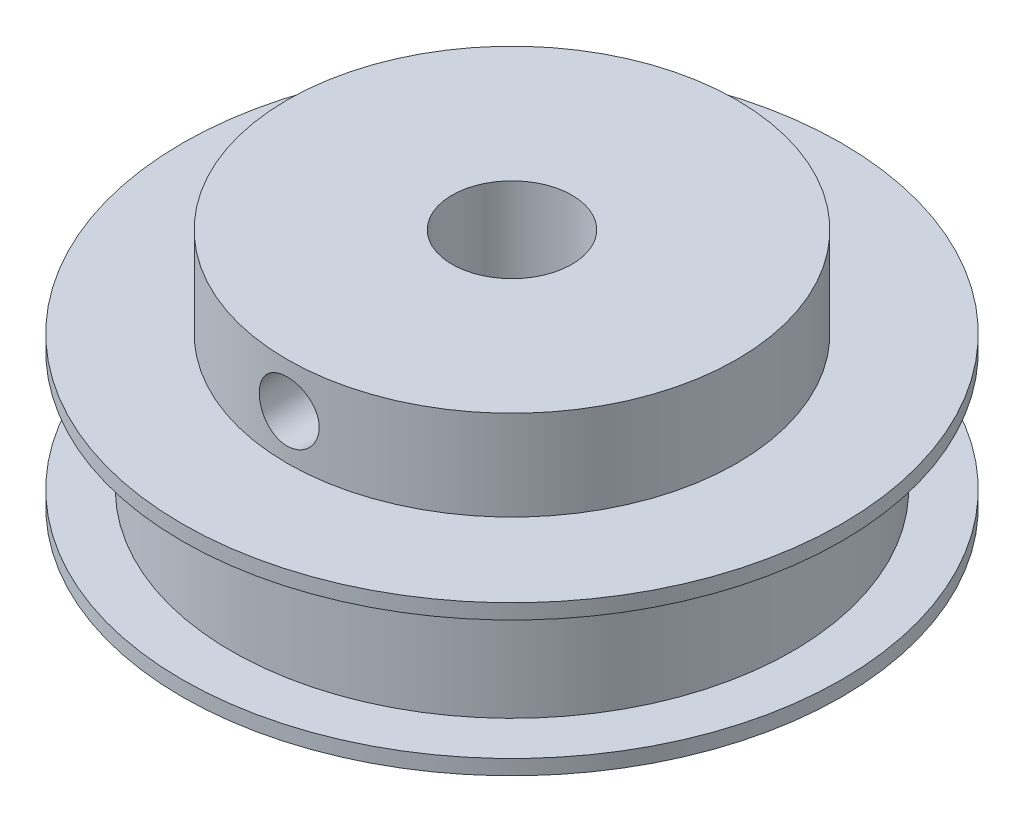
ISO-10303-21;
HEADER;
FILE_DESCRIPTION(('STEP AP214'),'2;1');
FILE_NAME('part.step','',(''),(''),'','','');
FILE_SCHEMA(('AUTOMOTIVE_DESIGN { 1 0 10303 214 1 1 1 1 }'));
ENDSEC;
DATA;
#1=APPLICATION_CONTEXT('core data for automotive mechanical design processes');
#2=APPLICATION_PROTOCOL_DEFINITION('international standard','automotive_design',2000,#1);
#3=PRODUCT_CONTEXT('',#1,'mechanical');
#4=PRODUCT('Part','Part','',(#3));
#5=PRODUCT_RELATED_PRODUCT_CATEGORY('part','',(#4));
#6=PRODUCT_DEFINITION_FORMATION('','',#4);
#7=PRODUCT_DEFINITION_CONTEXT('part definition',#1,'design');
#8=PRODUCT_DEFINITION('design','',#6,#7);
#9=PRODUCT_DEFINITION_SHAPE('','',#8);
#10=(LENGTH_UNIT() NAMED_UNIT(*) SI_UNIT(.MILLI.,.METRE.));
#11=(NAMED_UNIT(*) PLANE_ANGLE_UNIT() SI_UNIT($,.RADIAN.));
#12=(NAMED_UNIT(*) SI_UNIT($,.STERADIAN.) SOLID_ANGLE_UNIT());
#13=UNCERTAINTY_MEASURE_WITH_UNIT(LENGTH_MEASURE(1.E-05),#10,'distance_accuracy_value','');
#14=(GEOMETRIC_REPRESENTATION_CONTEXT(3) GLOBAL_UNCERTAINTY_ASSIGNED_CONTEXT((#13)) GLOBAL_UNIT_ASSIGNED_CONTEXT((#10,
#11,#12)) REPRESENTATION_CONTEXT('',''));
#15=CARTESIAN_POINT('',(0.,0.,0.));
#16=DIRECTION('',(0.,0.,1.));
#17=DIRECTION('',(1.,0.,0.));
#18=AXIS2_PLACEMENT_3D('',#15,#16,#17);
#19=CARTESIAN_POINT('',(22.0154,10.0154,22.0154));
#20=DIRECTION('',(0.,-1.,0.));
#21=DIRECTION('',(0.,0.,-1.));
#22=AXIS2_PLACEMENT_3D('',#19,#20,#21);
#23=PLANE('',#22);
#24=CARTESIAN_POINT('',(22.0154,10.0154,22.0154));
#25=DIRECTION('',(0.,-1.,0.));
#26=DIRECTION('',(0.,0.,-1.));
#27=AXIS2_PLACEMENT_3D('',#24,#25,#26);
#28=CIRCLE('',#27,15.);
#29=CARTESIAN_POINT('',(22.0154,10.0154,7.0154));
#30=VERTEX_POINT('',#29);
#31=EDGE_CURVE('E16',#30,#30,#28,.F.);
#32=ORIENTED_EDGE('',*,*,#31,.F.);
#33=EDGE_LOOP('',(#32));
#34=FACE_BOUND('',#33,.T.);
#35=CARTESIAN_POINT('',(22.0154,10.0154,22.0154));
#36=DIRECTION('',(0.,-1.,0.));
#37=DIRECTION('',(0.,0.,-1.));
#38=AXIS2_PLACEMENT_3D('',#35,#36,#37);
#39=CIRCLE('',#38,22.);
#40=CARTESIAN_POINT('',(22.0154,10.0154,0.0154000000000022));
#41=VERTEX_POINT('',#40);
#42=EDGE_CURVE('E175',#41,#41,#39,.T.);
#43=ORIENTED_EDGE('',*,*,#42,.F.);
#44=EDGE_LOOP('',(#43));
#45=FACE_BOUND('',#44,.T.);
#46=ADVANCED_FACE('F13',(#34,#45),#23,.F.);
#47=CARTESIAN_POINT('',(22.0154,16.0154,22.0154));
#48=DIRECTION('',(0.,-1.,0.));
#49=DIRECTION('',(0.,0.,-1.));
#50=AXIS2_PLACEMENT_3D('',#47,#48,#49);
#51=CYLINDRICAL_SURFACE('',#50,15.);
#52=ORIENTED_EDGE('',*,*,#31,.T.);
#53=EDGE_LOOP('',(#52));
#54=FACE_BOUND('',#53,.T.);
#55=CARTESIAN_POINT('',(22.0154,11.0154,37.0154));
#56=CARTESIAN_POINT('',(21.9036946954934,11.0154049613431,37.0153983257674));
#57=CARTESIAN_POINT('',(21.7918437427988,11.0247976429549,37.0141380496961));
#58=CARTESIAN_POINT('',(21.5711796176118,11.0621369309743,37.0092289387345));
#59=CARTESIAN_POINT('',(21.4623732214976,11.0901219508408,37.0055751588671));
#60=CARTESIAN_POINT('',(21.2511417659181,11.1638062974057,36.9962902244685));
#61=CARTESIAN_POINT('',(21.1487098272994,11.2094861295703,36.990661246671));
#62=CARTESIAN_POINT('',(20.9530121858702,11.3172222450371,36.9780521426859));
#63=CARTESIAN_POINT('',(20.8597427640481,11.3792718459401,36.9710725681426));
#64=CARTESIAN_POINT('',(20.6843766330214,11.5184115007537,36.9564901322612));
#65=CARTESIAN_POINT('',(20.6023462037743,11.5955847596861,36.9488839642909));
#66=CARTESIAN_POINT('',(20.4523559962916,11.7626056755836,36.933931744923));
#67=CARTESIAN_POINT('',(20.3843976685819,11.8524546375333,36.9265857204051));
#68=CARTESIAN_POINT('',(20.2642407285059,12.0426995426072,36.9129543242582));
#69=CARTESIAN_POINT('',(20.2121034729947,12.1431345628483,36.9066731227066));
#70=CARTESIAN_POINT('',(20.1254612435027,12.3514320106051,36.8959258346049));
#71=CARTESIAN_POINT('',(20.0909553564559,12.4592940531733,36.8914596540638));
#72=CARTESIAN_POINT('',(20.0407539551392,12.678705715276,36.8848793685706));
#73=CARTESIAN_POINT('',(20.0249479847177,12.7902296410357,36.8827514573656));
#74=CARTESIAN_POINT('',(20.0122531895047,13.0143659849075,36.8810465154151));
#75=CARTESIAN_POINT('',(20.0153635351347,13.1269783550694,36.8814693728052));
#76=CARTESIAN_POINT('',(20.0403224842393,13.3493206475116,36.8848055504524));
#77=CARTESIAN_POINT('',(20.0620488270012,13.4590645727699,36.8877026208903));
#78=CARTESIAN_POINT('',(20.1234324153905,13.6733359230729,36.8956354837488));
#79=CARTESIAN_POINT('',(20.1630902258453,13.7778631836814,36.9006713435393));
#80=CARTESIAN_POINT('',(20.2593426149041,13.9791136822843,36.9123328460932));
#81=CARTESIAN_POINT('',(20.3159904626973,14.0758111422296,36.9189634758238));
#82=CARTESIAN_POINT('',(20.4445719787059,14.2583660110646,36.933062963231));
#83=CARTESIAN_POINT('',(20.516505215272,14.3442237259525,36.9405317972346));
#84=CARTESIAN_POINT('',(20.6742767329484,14.5033649079682,36.9555372895568));
#85=CARTESIAN_POINT('',(20.7602176994564,14.5765465915741,36.9630740277318));
#86=CARTESIAN_POINT('',(20.9432634149749,14.7074959146257,36.9773161866147));
#87=CARTESIAN_POINT('',(21.0403732241592,14.7652565277029,36.9840212276305));
#88=CARTESIAN_POINT('',(21.2431069606347,14.8637198858254,36.9958501014816));
#89=CARTESIAN_POINT('',(21.3487411358715,14.904401723372,37.000971994248));
#90=CARTESIAN_POINT('',(21.5652829965604,14.9673371997727,37.0090343309841));
#91=CARTESIAN_POINT('',(21.6761789968537,14.989629821051,37.0119793881381));
#92=CARTESIAN_POINT('',(21.8257688953526,15.0067537566856,37.0142493301432));
#93=CARTESIAN_POINT('',(21.8636166300375,15.009993618395,37.0146799483052));
#94=CARTESIAN_POINT('',(21.9394372945199,15.0143175841836,37.0152555679917));
#95=CARTESIAN_POINT('',(21.9774102243733,15.0154016872996,37.0154005693886));
#96=CARTESIAN_POINT('',(22.1271053045067,15.0153950386569,37.0153983257674));
#97=CARTESIAN_POINT('',(22.2389562572012,15.0060023570451,37.0141380496961));
#98=CARTESIAN_POINT('',(22.4596203823882,14.9686630690257,37.0092289387345));
#99=CARTESIAN_POINT('',(22.5684267785024,14.9406780491592,37.0055751588671));
#100=CARTESIAN_POINT('',(22.7796582340819,14.8669937025943,36.9962902244685));
#101=CARTESIAN_POINT('',(22.8820901727007,14.8213138704297,36.990661246671));
#102=CARTESIAN_POINT('',(23.0777878141298,14.7135777549629,36.9780521426859));
#103=CARTESIAN_POINT('',(23.171057235952,14.6515281540599,36.9710725681426));
#104=CARTESIAN_POINT('',(23.3464233669786,14.5123884992463,36.9564901322612));
#105=CARTESIAN_POINT('',(23.4284537962257,14.4352152403139,36.9488839642909));
#106=CARTESIAN_POINT('',(23.5784440037084,14.2681943244164,36.933931744923));
#107=CARTESIAN_POINT('',(23.6464023314181,14.1783453624667,36.9265857204051));
#108=CARTESIAN_POINT('',(23.7665592714941,13.9881004573928,36.9129543242582));
#109=CARTESIAN_POINT('',(23.8186965270053,13.8876654371516,36.9066731227066));
#110=CARTESIAN_POINT('',(23.9053387564973,13.6793679893949,36.8959258346049));
#111=CARTESIAN_POINT('',(23.9398446435441,13.5715059468267,36.8914596540638));
#112=CARTESIAN_POINT('',(23.9900460448608,13.352094284724,36.8848793685706));
#113=CARTESIAN_POINT('',(24.0058520152824,13.2405703589643,36.8827514573656));
#114=CARTESIAN_POINT('',(24.0185468104953,13.0164340150925,36.8810465154151));
#115=CARTESIAN_POINT('',(24.0154364648653,12.9038216449306,36.8814693728052));
#116=CARTESIAN_POINT('',(23.9904775157607,12.6814793524884,36.8848055504524));
#117=CARTESIAN_POINT('',(23.9687511729988,12.5717354272301,36.8877026208903));
#118=CARTESIAN_POINT('',(23.9073675846095,12.3574640769271,36.8956354837488));
#119=CARTESIAN_POINT('',(23.8677097741547,12.2529368163186,36.9006713435393));
#120=CARTESIAN_POINT('',(23.7714573850959,12.0516863177156,36.9123328460932));
#121=CARTESIAN_POINT('',(23.7148095373027,11.9549888577704,36.9189634758238));
#122=CARTESIAN_POINT('',(23.5862280212941,11.7724339889354,36.933062963231));
#123=CARTESIAN_POINT('',(23.514294784728,11.6865762740475,36.9405317972346));
#124=CARTESIAN_POINT('',(23.3565232670516,11.5274350920318,36.9555372895568));
#125=CARTESIAN_POINT('',(23.2705823005436,11.4542534084259,36.9630740277318));
#126=CARTESIAN_POINT('',(23.0875365850251,11.3233040853743,36.9773161866147));
#127=CARTESIAN_POINT('',(22.9904267758408,11.2655434722971,36.9840212276305));
#128=CARTESIAN_POINT('',(22.7876930393653,11.1670801141746,36.9958501014816));
#129=CARTESIAN_POINT('',(22.6820588641285,11.126398276628,37.000971994248));
#130=CARTESIAN_POINT('',(22.4655170034396,11.0634628002273,37.0090343309841));
#131=CARTESIAN_POINT('',(22.3546210031463,11.041170178949,37.0119793881381));
#132=CARTESIAN_POINT('',(22.2050311046474,11.0240462433144,37.0142493301432));
#133=CARTESIAN_POINT('',(22.1671833699625,11.020806381605,37.0146799483052));
#134=CARTESIAN_POINT('',(22.0913627054801,11.0164824158164,37.0152555679917));
#135=CARTESIAN_POINT('',(22.0533897756267,11.0153983127004,37.0154005693886));
#136=CARTESIAN_POINT('',(22.0154,11.0154,37.0154));
#137=B_SPLINE_CURVE_WITH_KNOTS('',3,(#55,#56,#57,#58,#59,#60,#61,#62,#63,#64,#65,#66,#67,#68,
#69,#70,#71,#72,#73,#74,#75,#76,#77,#78,#79,#80,#81,#82,#83,#84,#85,#86,#87,#88,#89,#90,#91,#92,
#93,#94,#95,#96,#97,#98,#99,#100,#101,#102,#103,#104,#105,#106,#107,#108,#109,#110,#111,#112,
#113,#114,#115,#116,#117,#118,#119,#120,#121,#122,#123,#124,#125,#126,#127,#128,#129,#130,#131,
#132,#133,#134,#135,#136),.UNSPECIFIED.,.T.,.F.,(4,2,2,2,2,2,2,2,2,2,2,2,2,2,2,2,2,2,2,2,2,2,2,
2,2,2,2,2,2,2,2,2,2,2,2,2,2,2,2,2,4),(0.,0.3349710946203,0.670636431196389,1.00593300922501,
1.34109292509753,1.67815133874286,2.0152444784646,2.35362869053303,2.69199537710991,
3.02835326836906,3.36469640869538,3.69884739684642,4.03300891123243,4.36822928005666,
4.70344018373746,5.04122910693761,5.37917167670539,5.71752675115172,6.05516270604257,
6.16908273067098,6.2830028061969,6.6179739008172,6.95363923739329,7.28893581542191,
7.62409573129444,7.96115414493977,8.2982472846615,8.63663149672993,8.97499818330681,
9.31135607456596,9.64769921489228,9.98185020304332,10.3160117174293,10.6512320862536,
10.9864429899344,11.3242319131345,11.6621744829023,12.0005295573486,12.3381655122395,
12.4520855368679,12.5660056123938),.UNSPECIFIED.);
#138=CARTESIAN_POINT('',(22.0154,11.0154,37.0154));
#139=VERTEX_POINT('',#138);
#140=EDGE_CURVE('E178',#139,#139,#137,.T.);
#141=ORIENTED_EDGE('',*,*,#140,.T.);
#142=EDGE_LOOP('',(#141));
#143=FACE_BOUND('',#142,.T.);
#144=CARTESIAN_POINT('',(22.0154,16.0154,22.0154));
#145=DIRECTION('',(0.,-1.,0.));
#146=DIRECTION('',(0.,0.,-1.));
#147=AXIS2_PLACEMENT_3D('',#144,#145,#146);
#148=CIRCLE('',#147,15.);
#149=CARTESIAN_POINT('',(22.0154,16.0154,7.0154));
#150=VERTEX_POINT('',#149);
#151=EDGE_CURVE('E176',#150,#150,#148,.T.);
#152=ORIENTED_EDGE('',*,*,#151,.T.);
#153=EDGE_LOOP('',(#152));
#154=FACE_BOUND('',#153,.T.);
#155=ADVANCED_FACE('F148',(#54,#143,#154),#51,.T.);
#156=CARTESIAN_POINT('',(22.0154,10.0154,22.0154));
#157=DIRECTION('',(0.,-1.,0.));
#158=DIRECTION('',(0.,0.,-1.));
#159=AXIS2_PLACEMENT_3D('',#156,#157,#158);
#160=CYLINDRICAL_SURFACE('',#159,22.);
#161=ORIENTED_EDGE('',*,*,#42,.T.);
#162=EDGE_LOOP('',(#161));
#163=FACE_BOUND('',#162,.T.);
#164=CARTESIAN_POINT('',(22.0154,9.0154,22.0154));
#165=DIRECTION('',(0.,-1.,0.));
#166=DIRECTION('',(0.,0.,-1.));
#167=AXIS2_PLACEMENT_3D('',#164,#165,#166);
#168=CIRCLE('',#167,22.);
#169=CARTESIAN_POINT('',(22.0154,9.0154,0.0154000000000022));
#170=VERTEX_POINT('',#169);
#171=EDGE_CURVE('E185',#170,#170,#168,.T.);
#172=ORIENTED_EDGE('',*,*,#171,.F.);
#173=EDGE_LOOP('',(#172));
#174=FACE_BOUND('',#173,.T.);
#175=ADVANCED_FACE('F140',(#163,#174),#160,.T.);
#176=CARTESIAN_POINT('',(22.0154,16.0154,22.0154));
#177=DIRECTION('',(0.,-1.,0.));
#178=DIRECTION('',(0.,0.,-1.));
#179=AXIS2_PLACEMENT_3D('',#176,#177,#178);
#180=PLANE('',#179);
#181=CARTESIAN_POINT('',(22.0154,16.0154,22.0154));
#182=DIRECTION('',(0.,-1.,0.));
#183=DIRECTION('',(0.,0.,-1.));
#184=AXIS2_PLACEMENT_3D('',#181,#182,#183);
#185=CIRCLE('',#184,4.);
#186=CARTESIAN_POINT('',(22.0154,16.0154,18.0154));
#187=VERTEX_POINT('',#186);
#188=EDGE_CURVE('E44',#187,#187,#185,.T.);
#189=ORIENTED_EDGE('',*,*,#188,.T.);
#190=EDGE_LOOP('',(#189));
#191=FACE_BOUND('',#190,.T.);
#192=ORIENTED_EDGE('',*,*,#151,.F.);
#193=EDGE_LOOP('',(#192));
#194=FACE_BOUND('',#193,.T.);
#195=ADVANCED_FACE('F64',(#191,#194),#180,.F.);
#196=CARTESIAN_POINT('',(22.0154,13.0154,37.0154));
#197=DIRECTION('',(0.,0.,-1.));
#198=DIRECTION('',(0.,1.,0.));
#199=AXIS2_PLACEMENT_3D('',#196,#197,#198);
#200=CYLINDRICAL_SURFACE('',#199,2.);
#201=ORIENTED_EDGE('',*,*,#140,.F.);
#202=EDGE_LOOP('',(#201));
#203=FACE_BOUND('',#202,.T.);
#204=CARTESIAN_POINT('',(22.0154,15.0154,26.0154));
#205=CARTESIAN_POINT('',(22.1205439259025,15.0153933953656,26.0153942681008));
#206=CARTESIAN_POINT('',(22.2258131993951,15.0070598537579,26.0112098203951));
#207=CARTESIAN_POINT('',(22.4332404705378,14.9740942393169,25.9948831207431));
#208=CARTESIAN_POINT('',(22.5353921734273,14.9494312140044,25.9827257565784));
#209=CARTESIAN_POINT('',(22.7332670897609,14.8850123827667,25.9517255880675));
#210=CARTESIAN_POINT('',(22.8290136058783,14.8453152315041,25.9329087835507));
#211=CARTESIAN_POINT('',(23.0123452336132,14.75225875727,25.8903155303152));
#212=CARTESIAN_POINT('',(23.0999309879801,14.6989005115023,25.8665394726705));
#213=CARTESIAN_POINT('',(23.2704156355238,14.5763655010294,25.8145251651612));
#214=CARTESIAN_POINT('',(23.3527104222442,14.5064270415207,25.7861039825507));
#215=CARTESIAN_POINT('',(23.504958889734,14.3543570415059,25.7285994049349));
#216=CARTESIAN_POINT('',(23.5749031662135,14.2722162964551,25.6995155241807));
#217=CARTESIAN_POINT('',(23.7059040009006,14.0904333009532,25.6413790239469));
#218=CARTESIAN_POINT('',(23.7658506711033,13.9899278033082,25.6125037394026));
#219=CARTESIAN_POINT('',(23.8677364537814,13.7786653280276,25.5611195754464));
#220=CARTESIAN_POINT('',(23.9096884299327,13.6679157425545,25.5386061521398));
#221=CARTESIAN_POINT('',(23.9716648843772,13.4460697891562,25.5045573407562));
#222=CARTESIAN_POINT('',(23.9928517141609,13.3353910958652,25.4924454316743));
#223=CARTESIAN_POINT('',(24.0162539866177,13.111442324441,25.4790377989706));
#224=CARTESIAN_POINT('',(24.0184881767461,12.9981749182577,25.4777313868658));
#225=CARTESIAN_POINT('',(24.0047745743446,12.7868279513693,25.485618605145));
#226=CARTESIAN_POINT('',(23.9909691190736,12.6885519375539,25.4935752732403));
#227=CARTESIAN_POINT('',(23.9492796981139,12.4959561812539,25.516924574677));
#228=CARTESIAN_POINT('',(23.9213912477953,12.4016377093894,25.5323195766355));
#229=CARTESIAN_POINT('',(23.851819560772,12.2169417348687,25.5691495282548));
#230=CARTESIAN_POINT('',(23.809830134232,12.1267072024284,25.59071681328));
#231=CARTESIAN_POINT('',(23.713483375336,11.95413141482,25.6374680856281));
#232=CARTESIAN_POINT('',(23.6591204876249,11.8717937287998,25.6626536956038));
#233=CARTESIAN_POINT('',(23.5315321098256,11.7063574945135,25.7176631580657));
#234=CARTESIAN_POINT('',(23.4567889167386,11.6244862528477,25.7476702047349));
#235=CARTESIAN_POINT('',(23.2945111574827,11.4739291628182,25.8063524660081));
#236=CARTESIAN_POINT('',(23.2069705131486,11.4052496159322,25.835027039176));
#237=CARTESIAN_POINT('',(23.0164330116637,11.2800286779405,25.8894397456593));
#238=CARTESIAN_POINT('',(22.9129071831988,11.2241990551085,25.9149796832401));
#239=CARTESIAN_POINT('',(22.6963324309776,11.131205941914,25.9585576224248));
#240=CARTESIAN_POINT('',(22.5832911525306,11.0940276299697,25.9766015788711));
#241=CARTESIAN_POINT('',(22.3609329833214,11.0424491925666,26.0018866748287));
#242=CARTESIAN_POINT('',(22.2520830610967,11.0264175285064,26.0098987660262));
#243=CARTESIAN_POINT('',(22.0329591998987,11.012470537731,26.0168602691821));
#244=CARTESIAN_POINT('',(21.9226859602602,11.0145466287211,26.0158139744264));
#245=CARTESIAN_POINT('',(21.712934056028,11.0358133768375,26.0052238450687));
#246=CARTESIAN_POINT('',(21.6132811839001,11.05366506546,25.9963449137634));
#247=CARTESIAN_POINT('',(21.4185862153961,11.1038761437902,25.9718434262968));
#248=CARTESIAN_POINT('',(21.3235446286178,11.136237132907,25.9562201266882));
#249=CARTESIAN_POINT('',(21.1376227831009,11.2153969328661,25.9190850282718));
#250=CARTESIAN_POINT('',(21.0469392059884,11.2625821002326,25.8974176353926));
#251=CARTESIAN_POINT('',(20.8744772766015,11.3696150712931,25.8502794863484));
#252=CARTESIAN_POINT('',(20.7927027404468,11.4294682691908,25.8248071113388));
#253=CARTESIAN_POINT('',(20.6318646214216,11.5669208506614,25.769564426724));
#254=CARTESIAN_POINT('',(20.5538558443619,11.6456857368903,25.73961769687));
#255=CARTESIAN_POINT('',(20.4116873577623,11.8152503025555,25.6806478321764));
#256=CARTESIAN_POINT('',(20.3475372285763,11.9060582376958,25.6516253480009));
#257=CARTESIAN_POINT('',(20.231984171042,12.1026873083459,25.5964238441298));
#258=CARTESIAN_POINT('',(20.1813490083995,12.209022532189,25.5704505917812));
#259=CARTESIAN_POINT('',(20.0992343481306,12.4304201351499,25.5268814458827));
#260=CARTESIAN_POINT('',(20.067730168266,12.5454710529338,25.509274764435));
#261=CARTESIAN_POINT('',(20.0276766250663,12.7692204457694,25.486630020516));
#262=CARTESIAN_POINT('',(20.0172140071891,12.8774685068705,25.4805476693013));
#263=CARTESIAN_POINT('',(20.0140216912476,13.094294134329,25.4787070928321));
#264=CARTESIAN_POINT('',(20.0212843067535,13.2028715374757,25.4829443925278));
#265=CARTESIAN_POINT('',(20.0515477488134,13.4063670030669,25.5001572410215));
#266=CARTESIAN_POINT('',(20.0729833713139,13.5016009402895,25.5122618896532));
#267=CARTESIAN_POINT('',(20.1290492835512,13.6870162388487,25.5428203237531));
#268=CARTESIAN_POINT('',(20.1636838176802,13.7771959641841,25.5612761513934));
#269=CARTESIAN_POINT('',(20.2477685093989,13.9566497019731,25.6039706072907));
#270=CARTESIAN_POINT('',(20.2980577243686,14.0454558036581,25.6285144479184));
#271=CARTESIAN_POINT('',(20.4110980567252,14.2139490723625,25.6801066326972));
#272=CARTESIAN_POINT('',(20.4738556575169,14.2936314610422,25.7071562759122));
#273=CARTESIAN_POINT('',(20.6189933466773,14.4516839647093,25.7646464631618));
#274=CARTESIAN_POINT('',(20.7028311540055,14.5287182047006,25.7950996661326));
#275=CARTESIAN_POINT('',(20.8830903875336,14.6679259668705,25.8529550451986));
#276=CARTESIAN_POINT('',(20.9795185533896,14.7300914789398,25.8803555725239));
#277=CARTESIAN_POINT('',(21.1835368064341,14.8378727254241,25.9293601913307));
#278=CARTESIAN_POINT('',(21.2912009924465,14.8833683384729,25.9509219298787));
#279=CARTESIAN_POINT('',(21.5139157977238,14.9550163355148,25.9854268259797));
#280=CARTESIAN_POINT('',(21.6289444008218,14.9812236936114,25.9983944672614));
#281=CARTESIAN_POINT('',(21.7901961070182,15.0031948221715,26.0093092382696));
#282=CARTESIAN_POINT('',(21.8350762411169,15.0077652817327,26.011587306805));
#283=CARTESIAN_POINT('',(21.9250965363898,15.0138693310282,26.0146339395363));
#284=CARTESIAN_POINT('',(21.9702367047067,15.0154028369404,26.0154024620676));
#285=CARTESIAN_POINT('',(22.0154,15.0154,26.0154));
#286=B_SPLINE_CURVE_WITH_KNOTS('',3,(#204,#205,#206,#207,#208,#209,#210,#211,#212,#213,#214,
#215,#216,#217,#218,#219,#220,#221,#222,#223,#224,#225,#226,#227,#228,#229,#230,#231,#232,#233,
#234,#235,#236,#237,#238,#239,#240,#241,#242,#243,#244,#245,#246,#247,#248,#249,#250,#251,#252,
#253,#254,#255,#256,#257,#258,#259,#260,#261,#262,#263,#264,#265,#266,#267,#268,#269,#270,#271,
#272,#273,#274,#275,#276,#277,#278,#279,#280,#281,#282,#283,#284,#285),.UNSPECIFIED.,.T.,.F.,(4,
2,2,2,2,2,2,2,2,2,2,2,2,2,2,2,2,2,2,2,2,2,2,2,2,2,2,2,2,2,2,2,2,2,2,2,2,2,2,2,4),(0.,
0.315248514840585,0.631096299418394,0.945724310984594,1.26032752116313,1.59396351743618,
1.92785247530807,2.28763452861505,2.64715895796562,2.98516024280459,3.32282714658041,
3.62011424818641,3.91749607851357,4.22180480336974,4.52625042520443,4.86929882667756,
5.21251069197372,5.57166044428881,5.93052433824559,6.25966580942691,6.58865129022951,
6.89213813012243,7.19565843261863,7.50785712055797,7.82018901496678,8.16319221288837,
8.50643177230863,8.86629364323451,9.22569023890901,9.55058615006092,9.87534119729356,
10.1691586049771,10.463070575767,10.7767291356057,11.0905512228726,11.4425048551434,
11.7946476676249,12.1492802732705,12.502898172423,12.6383056026783,12.7737167702213),.UNSPECIFIED.);
#287=CARTESIAN_POINT('',(22.0154,15.0154,26.0154));
#288=VERTEX_POINT('',#287);
#289=EDGE_CURVE('E36',#288,#288,#286,.T.);
#290=ORIENTED_EDGE('',*,*,#289,.T.);
#291=EDGE_LOOP('',(#290));
#292=FACE_BOUND('',#291,.T.);
#293=ADVANCED_FACE('F46',(#203,#292),#200,.F.);
#294=CARTESIAN_POINT('',(22.0154,9.0154,22.0154));
#295=DIRECTION('',(0.,-1.,0.));
#296=DIRECTION('',(0.,0.,-1.));
#297=AXIS2_PLACEMENT_3D('',#294,#295,#296);
#298=PLANE('',#297);
#299=CARTESIAN_POINT('',(22.0154,9.0154,22.0154));
#300=DIRECTION('',(0.,-1.,0.));
#301=DIRECTION('',(0.,0.,-1.));
#302=AXIS2_PLACEMENT_3D('',#299,#300,#301);
#303=CIRCLE('',#302,18.717593171027);
#304=CARTESIAN_POINT('',(22.0154,9.0154,3.297806828973));
#305=VERTEX_POINT('',#304);
#306=EDGE_CURVE('E33',#305,#305,#303,.T.);
#307=ORIENTED_EDGE('',*,*,#306,.F.);
#308=EDGE_LOOP('',(#307));
#309=FACE_BOUND('',#308,.T.);
#310=ORIENTED_EDGE('',*,*,#171,.T.);
#311=EDGE_LOOP('',(#310));
#312=FACE_BOUND('',#311,.T.);
#313=ADVANCED_FACE('F54',(#309,#312),#298,.T.);
#314=CARTESIAN_POINT('',(22.0154,9.0154,22.0154));
#315=DIRECTION('',(0.,-1.,0.));
#316=DIRECTION('',(0.,0.,-1.));
#317=AXIS2_PLACEMENT_3D('',#314,#315,#316);
#318=CYLINDRICAL_SURFACE('',#317,18.717593171027);
#319=ORIENTED_EDGE('',*,*,#306,.T.);
#320=EDGE_LOOP('',(#319));
#321=FACE_BOUND('',#320,.T.);
#322=CARTESIAN_POINT('',(22.0154,1.0154,22.0154));
#323=DIRECTION('',(0.,-1.,0.));
#324=DIRECTION('',(0.,0.,-1.));
#325=AXIS2_PLACEMENT_3D('',#322,#323,#324);
#326=CIRCLE('',#325,18.717593171027);
#327=CARTESIAN_POINT('',(22.0154,1.0154,3.297806828973));
#328=VERTEX_POINT('',#327);
#329=EDGE_CURVE('E30',#328,#328,#326,.F.);
#330=ORIENTED_EDGE('',*,*,#329,.T.);
#331=EDGE_LOOP('',(#330));
#332=FACE_BOUND('',#331,.T.);
#333=ADVANCED_FACE('F52',(#321,#332),#318,.T.);
#334=CARTESIAN_POINT('',(22.0154,1.0154,22.0154));
#335=DIRECTION('',(0.,-1.,0.));
#336=DIRECTION('',(0.,0.,-1.));
#337=AXIS2_PLACEMENT_3D('',#334,#335,#336);
#338=PLANE('',#337);
#339=ORIENTED_EDGE('',*,*,#329,.F.);
#340=EDGE_LOOP('',(#339));
#341=FACE_BOUND('',#340,.T.);
#342=CARTESIAN_POINT('',(22.0154,1.0154,22.0154));
#343=DIRECTION('',(0.,-1.,0.));
#344=DIRECTION('',(0.,0.,-1.));
#345=AXIS2_PLACEMENT_3D('',#342,#343,#344);
#346=CIRCLE('',#345,22.);
#347=CARTESIAN_POINT('',(22.0154,1.0154,0.0154000000000022));
#348=VERTEX_POINT('',#347);
#349=EDGE_CURVE('E25',#348,#348,#346,.T.);
#350=ORIENTED_EDGE('',*,*,#349,.F.);
#351=EDGE_LOOP('',(#350));
#352=FACE_BOUND('',#351,.T.);
#353=ADVANCED_FACE('F62',(#341,#352),#338,.F.);
#354=CARTESIAN_POINT('',(22.0154,1.0154,22.0154));
#355=DIRECTION('',(0.,-1.,0.));
#356=DIRECTION('',(0.,0.,-1.));
#357=AXIS2_PLACEMENT_3D('',#354,#355,#356);
#358=CYLINDRICAL_SURFACE('',#357,22.);
#359=ORIENTED_EDGE('',*,*,#349,.T.);
#360=EDGE_LOOP('',(#359));
#361=FACE_BOUND('',#360,.T.);
#362=CARTESIAN_POINT('',(22.0154,0.0154,22.0154));
#363=DIRECTION('',(0.,-1.,0.));
#364=DIRECTION('',(0.,0.,-1.));
#365=AXIS2_PLACEMENT_3D('',#362,#363,#364);
#366=CIRCLE('',#365,22.);
#367=CARTESIAN_POINT('',(22.0154,0.0153999999999976,0.0154000000000022));
#368=VERTEX_POINT('',#367);
#369=EDGE_CURVE('E20',#368,#368,#366,.T.);
#370=ORIENTED_EDGE('',*,*,#369,.F.);
#371=EDGE_LOOP('',(#370));
#372=FACE_BOUND('',#371,.T.);
#373=ADVANCED_FACE('F75',(#361,#372),#358,.T.);
#374=CARTESIAN_POINT('',(22.0154,1.0154,22.0154));
#375=DIRECTION('',(0.,-1.,0.));
#376=DIRECTION('',(0.,0.,-1.));
#377=AXIS2_PLACEMENT_3D('',#374,#375,#376);
#378=CYLINDRICAL_SURFACE('',#377,4.);
#379=ORIENTED_EDGE('',*,*,#188,.F.);
#380=EDGE_LOOP('',(#379));
#381=FACE_BOUND('',#380,.T.);
#382=CARTESIAN_POINT('',(22.0154,0.0154,22.0154));
#383=DIRECTION('',(0.,-1.,0.));
#384=DIRECTION('',(0.,0.,-1.));
#385=AXIS2_PLACEMENT_3D('',#382,#383,#384);
#386=CIRCLE('',#385,4.);
#387=CARTESIAN_POINT('',(22.0154,0.0153999999999996,18.0154));
#388=VERTEX_POINT('',#387);
#389=EDGE_CURVE('E8',#388,#388,#386,.F.);
#390=ORIENTED_EDGE('',*,*,#389,.F.);
#391=EDGE_LOOP('',(#390));
#392=FACE_BOUND('',#391,.T.);
#393=ORIENTED_EDGE('',*,*,#289,.F.);
#394=EDGE_LOOP('',(#393));
#395=FACE_BOUND('',#394,.T.);
#396=ADVANCED_FACE('F70',(#381,#392,#395),#378,.F.);
#397=CARTESIAN_POINT('',(22.0154,0.0154,22.0154));
#398=DIRECTION('',(0.,-1.,0.));
#399=DIRECTION('',(0.,0.,-1.));
#400=AXIS2_PLACEMENT_3D('',#397,#398,#399);
#401=PLANE('',#400);
#402=ORIENTED_EDGE('',*,*,#389,.T.);
#403=EDGE_LOOP('',(#402));
#404=FACE_BOUND('',#403,.T.);
#405=ORIENTED_EDGE('',*,*,#369,.T.);
#406=EDGE_LOOP('',(#405));
#407=FACE_BOUND('',#406,.T.);
#408=ADVANCED_FACE('F68',(#404,#407),#401,.T.);
#409=CLOSED_SHELL('',(#46,#155,#175,#195,#293,#313,#333,#353,#373,#396,#408));
#410=MANIFOLD_SOLID_BREP('B1',#409);
#411=ADVANCED_BREP_SHAPE_REPRESENTATION('',(#18,#410),#14);
#412=SHAPE_DEFINITION_REPRESENTATION(#9,#411);
ENDSEC;
END-ISO-10303-21;
